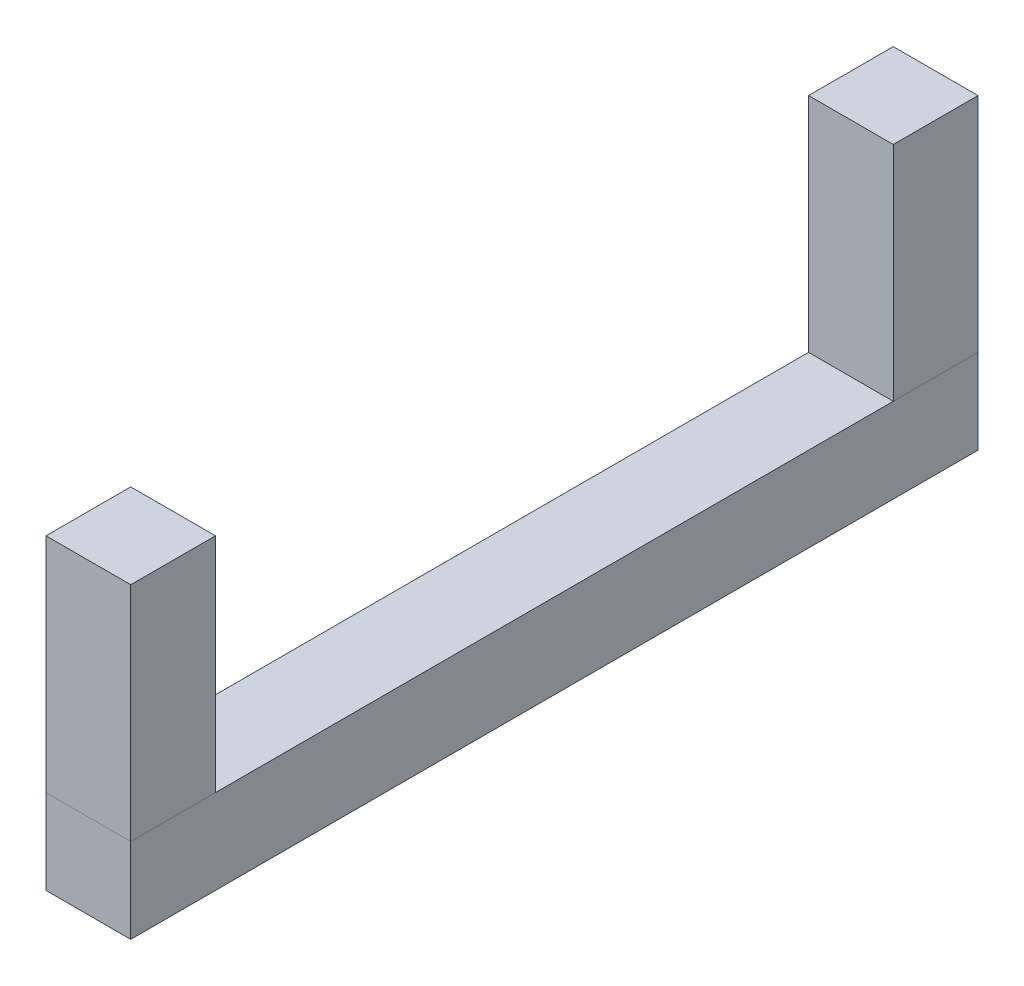
ISO-10303-21;
HEADER;
FILE_DESCRIPTION(('STEP AP214'),'2;1');
FILE_NAME('part.step','',(''),(''),'','','');
FILE_SCHEMA(('AUTOMOTIVE_DESIGN { 1 0 10303 214 1 1 1 1 }'));
ENDSEC;
DATA;
#1=APPLICATION_CONTEXT('core data for automotive mechanical design processes');
#2=APPLICATION_PROTOCOL_DEFINITION('international standard','automotive_design',2000,#1);
#3=PRODUCT_CONTEXT('',#1,'mechanical');
#4=PRODUCT('Part','Part','',(#3));
#5=PRODUCT_RELATED_PRODUCT_CATEGORY('part','',(#4));
#6=PRODUCT_DEFINITION_FORMATION('','',#4);
#7=PRODUCT_DEFINITION_CONTEXT('part definition',#1,'design');
#8=PRODUCT_DEFINITION('design','',#6,#7);
#9=PRODUCT_DEFINITION_SHAPE('','',#8);
#10=(LENGTH_UNIT() NAMED_UNIT(*) SI_UNIT(.MILLI.,.METRE.));
#11=(NAMED_UNIT(*) PLANE_ANGLE_UNIT() SI_UNIT($,.RADIAN.));
#12=(NAMED_UNIT(*) SI_UNIT($,.STERADIAN.) SOLID_ANGLE_UNIT());
#13=UNCERTAINTY_MEASURE_WITH_UNIT(LENGTH_MEASURE(1.E-05),#10,'distance_accuracy_value','');
#14=(GEOMETRIC_REPRESENTATION_CONTEXT(3) GLOBAL_UNCERTAINTY_ASSIGNED_CONTEXT((#13)) GLOBAL_UNIT_ASSIGNED_CONTEXT((#10,
#11,#12)) REPRESENTATION_CONTEXT('',''));
#15=CARTESIAN_POINT('',(0.,0.,0.));
#16=DIRECTION('',(0.,0.,1.));
#17=DIRECTION('',(1.,0.,0.));
#18=AXIS2_PLACEMENT_3D('',#15,#16,#17);
#19=CARTESIAN_POINT('',(86.,-153.,202.));
#20=DIRECTION('',(1.,0.,0.));
#21=DIRECTION('',(0.,1.,0.));
#22=AXIS2_PLACEMENT_3D('',#19,#20,#21);
#23=PLANE('',#22);
#24=DIRECTION('',(0.,0.,1.));
#25=VECTOR('',#24,1.);
#26=CARTESIAN_POINT('',(86.,-153.,202.));
#27=LINE('',#26,#25);
#28=CARTESIAN_POINT('',(86.,-153.,202.));
#29=VERTEX_POINT('',#28);
#30=CARTESIAN_POINT('',(86.,-153.,210.));
#31=VERTEX_POINT('',#30);
#32=EDGE_CURVE('E142',#29,#31,#27,.T.);
#33=ORIENTED_EDGE('',*,*,#32,.F.);
#34=DIRECTION('',(0.,1.,0.));
#35=VECTOR('',#34,1.);
#36=CARTESIAN_POINT('',(86.,-153.,202.));
#37=LINE('',#36,#35);
#38=CARTESIAN_POINT('',(86.,-132.,202.));
#39=VERTEX_POINT('',#38);
#40=EDGE_CURVE('E27',#29,#39,#37,.T.);
#41=ORIENTED_EDGE('',*,*,#40,.T.);
#42=DIRECTION('',(0.,0.,1.));
#43=VECTOR('',#42,1.);
#44=CARTESIAN_POINT('',(86.,-132.,202.));
#45=LINE('',#44,#43);
#46=CARTESIAN_POINT('',(86.,-132.,210.));
#47=VERTEX_POINT('',#46);
#48=EDGE_CURVE('E10',#39,#47,#45,.T.);
#49=ORIENTED_EDGE('',*,*,#48,.T.);
#50=DIRECTION('',(0.,1.,0.));
#51=VECTOR('',#50,1.);
#52=CARTESIAN_POINT('',(86.,-153.,210.));
#53=LINE('',#52,#51);
#54=EDGE_CURVE('E183',#31,#47,#53,.T.);
#55=ORIENTED_EDGE('',*,*,#54,.F.);
#56=EDGE_LOOP('',(#33,#41,#49,#55));
#57=FACE_BOUND('',#56,.T.);
#58=ADVANCED_FACE('F16',(#57),#23,.T.);
#59=CARTESIAN_POINT('',(78.,-132.,202.));
#60=DIRECTION('',(0.,1.,0.));
#61=DIRECTION('',(1.,0.,0.));
#62=AXIS2_PLACEMENT_3D('',#59,#60,#61);
#63=PLANE('',#62);
#64=DIRECTION('',(1.,0.,0.));
#65=VECTOR('',#64,1.);
#66=CARTESIAN_POINT('',(78.,-132.,202.));
#67=LINE('',#66,#65);
#68=CARTESIAN_POINT('',(78.,-132.,202.));
#69=VERTEX_POINT('',#68);
#70=EDGE_CURVE('E217',#69,#39,#67,.T.);
#71=ORIENTED_EDGE('',*,*,#70,.F.);
#72=DIRECTION('',(0.,0.,1.));
#73=VECTOR('',#72,1.);
#74=CARTESIAN_POINT('',(78.,-132.,202.));
#75=LINE('',#74,#73);
#76=CARTESIAN_POINT('',(78.,-132.,210.));
#77=VERTEX_POINT('',#76);
#78=EDGE_CURVE('E178',#69,#77,#75,.T.);
#79=ORIENTED_EDGE('',*,*,#78,.T.);
#80=DIRECTION('',(1.,0.,0.));
#81=VECTOR('',#80,1.);
#82=CARTESIAN_POINT('',(78.,-132.,210.));
#83=LINE('',#82,#81);
#84=EDGE_CURVE('E116',#77,#47,#83,.T.);
#85=ORIENTED_EDGE('',*,*,#84,.T.);
#86=ORIENTED_EDGE('',*,*,#48,.F.);
#87=EDGE_LOOP('',(#71,#79,#85,#86));
#88=FACE_BOUND('',#87,.T.);
#89=ADVANCED_FACE('F255',(#88),#63,.T.);
#90=CARTESIAN_POINT('',(78.,-153.,202.));
#91=DIRECTION('',(0.,0.,1.));
#92=DIRECTION('',(1.,0.,0.));
#93=AXIS2_PLACEMENT_3D('',#90,#91,#92);
#94=PLANE('',#93);
#95=ORIENTED_EDGE('',*,*,#70,.T.);
#96=ORIENTED_EDGE('',*,*,#40,.F.);
#97=DIRECTION('',(1.,0.,0.));
#98=VECTOR('',#97,1.);
#99=CARTESIAN_POINT('',(78.,-153.,202.));
#100=LINE('',#99,#98);
#101=CARTESIAN_POINT('',(78.,-153.,202.));
#102=VERTEX_POINT('',#101);
#103=EDGE_CURVE('E230',#102,#29,#100,.T.);
#104=ORIENTED_EDGE('',*,*,#103,.F.);
#105=DIRECTION('',(0.,1.,0.));
#106=VECTOR('',#105,1.);
#107=CARTESIAN_POINT('',(78.,-153.,202.));
#108=LINE('',#107,#106);
#109=EDGE_CURVE('E180',#102,#69,#108,.T.);
#110=ORIENTED_EDGE('',*,*,#109,.T.);
#111=EDGE_LOOP('',(#95,#96,#104,#110));
#112=FACE_BOUND('',#111,.T.);
#113=ADVANCED_FACE('F253',(#112),#94,.F.);
#114=CARTESIAN_POINT('',(78.,-153.,210.));
#115=DIRECTION('',(0.,0.,1.));
#116=DIRECTION('',(1.,0.,0.));
#117=AXIS2_PLACEMENT_3D('',#114,#115,#116);
#118=PLANE('',#117);
#119=DIRECTION('',(0.,1.,0.));
#120=VECTOR('',#119,1.);
#121=CARTESIAN_POINT('',(78.,-153.,210.));
#122=LINE('',#121,#120);
#123=CARTESIAN_POINT('',(78.,-153.,210.));
#124=VERTEX_POINT('',#123);
#125=EDGE_CURVE('E181',#124,#77,#122,.T.);
#126=ORIENTED_EDGE('',*,*,#125,.F.);
#127=DIRECTION('',(1.,0.,0.));
#128=VECTOR('',#127,1.);
#129=CARTESIAN_POINT('',(78.,-153.,210.));
#130=LINE('',#129,#128);
#131=EDGE_CURVE('E147',#124,#31,#130,.T.);
#132=ORIENTED_EDGE('',*,*,#131,.T.);
#133=ORIENTED_EDGE('',*,*,#54,.T.);
#134=ORIENTED_EDGE('',*,*,#84,.F.);
#135=EDGE_LOOP('',(#126,#132,#133,#134));
#136=FACE_BOUND('',#135,.T.);
#137=ADVANCED_FACE('F259',(#136),#118,.T.);
#138=CARTESIAN_POINT('',(86.,-161.,130.));
#139=DIRECTION('',(1.,0.,0.));
#140=DIRECTION('',(0.,1.,0.));
#141=AXIS2_PLACEMENT_3D('',#138,#139,#140);
#142=PLANE('',#141);
#143=DIRECTION('',(0.,0.,1.));
#144=VECTOR('',#143,1.);
#145=CARTESIAN_POINT('',(86.,-161.,130.));
#146=LINE('',#145,#144);
#147=CARTESIAN_POINT('',(86.,-161.,130.));
#148=VERTEX_POINT('',#147);
#149=CARTESIAN_POINT('',(86.,-161.,210.));
#150=VERTEX_POINT('',#149);
#151=EDGE_CURVE('E141',#148,#150,#146,.T.);
#152=ORIENTED_EDGE('',*,*,#151,.F.);
#153=DIRECTION('',(0.,1.,0.));
#154=VECTOR('',#153,1.);
#155=CARTESIAN_POINT('',(86.,-161.,130.));
#156=LINE('',#155,#154);
#157=CARTESIAN_POINT('',(86.,-153.,130.));
#158=VERTEX_POINT('',#157);
#159=EDGE_CURVE('E188',#148,#158,#156,.T.);
#160=ORIENTED_EDGE('',*,*,#159,.T.);
#161=DIRECTION('',(0.,0.,1.));
#162=VECTOR('',#161,1.);
#163=CARTESIAN_POINT('',(86.,-153.,130.));
#164=LINE('',#163,#162);
#165=CARTESIAN_POINT('',(86.,-153.,138.));
#166=VERTEX_POINT('',#165);
#167=EDGE_CURVE('E20',#158,#166,#164,.T.);
#168=ORIENTED_EDGE('',*,*,#167,.T.);
#169=DIRECTION('',(0.,0.,1.));
#170=VECTOR('',#169,1.);
#171=CARTESIAN_POINT('',(86.,-153.,130.));
#172=LINE('',#171,#170);
#173=EDGE_CURVE('E224',#166,#29,#172,.T.);
#174=ORIENTED_EDGE('',*,*,#173,.T.);
#175=ORIENTED_EDGE('',*,*,#32,.T.);
#176=DIRECTION('',(0.,1.,0.));
#177=VECTOR('',#176,1.);
#178=CARTESIAN_POINT('',(86.,-161.,210.));
#179=LINE('',#178,#177);
#180=EDGE_CURVE('E137',#150,#31,#179,.T.);
#181=ORIENTED_EDGE('',*,*,#180,.F.);
#182=EDGE_LOOP('',(#152,#160,#168,#174,#175,#181));
#183=FACE_BOUND('',#182,.T.);
#184=ADVANCED_FACE('F139',(#183),#142,.T.);
#185=CARTESIAN_POINT('',(86.,-153.,130.));
#186=DIRECTION('',(1.,0.,0.));
#187=DIRECTION('',(0.,1.,0.));
#188=AXIS2_PLACEMENT_3D('',#185,#186,#187);
#189=PLANE('',#188);
#190=ORIENTED_EDGE('',*,*,#167,.F.);
#191=DIRECTION('',(0.,1.,0.));
#192=VECTOR('',#191,1.);
#193=CARTESIAN_POINT('',(86.,-153.,130.));
#194=LINE('',#193,#192);
#195=CARTESIAN_POINT('',(86.,-132.,130.));
#196=VERTEX_POINT('',#195);
#197=EDGE_CURVE('E71',#158,#196,#194,.T.);
#198=ORIENTED_EDGE('',*,*,#197,.T.);
#199=DIRECTION('',(0.,0.,1.));
#200=VECTOR('',#199,1.);
#201=CARTESIAN_POINT('',(86.,-132.,130.));
#202=LINE('',#201,#200);
#203=CARTESIAN_POINT('',(86.,-132.,138.));
#204=VERTEX_POINT('',#203);
#205=EDGE_CURVE('E77',#196,#204,#202,.T.);
#206=ORIENTED_EDGE('',*,*,#205,.T.);
#207=DIRECTION('',(0.,1.,0.));
#208=VECTOR('',#207,1.);
#209=CARTESIAN_POINT('',(86.,-153.,138.));
#210=LINE('',#209,#208);
#211=EDGE_CURVE('E196',#166,#204,#210,.T.);
#212=ORIENTED_EDGE('',*,*,#211,.F.);
#213=EDGE_LOOP('',(#190,#198,#206,#212));
#214=FACE_BOUND('',#213,.T.);
#215=ADVANCED_FACE('F311',(#214),#189,.T.);
#216=CARTESIAN_POINT('',(78.,-161.,130.));
#217=DIRECTION('',(0.,0.,1.));
#218=DIRECTION('',(1.,0.,0.));
#219=AXIS2_PLACEMENT_3D('',#216,#217,#218);
#220=PLANE('',#219);
#221=DIRECTION('',(1.,0.,0.));
#222=VECTOR('',#221,1.);
#223=CARTESIAN_POINT('',(78.,-153.,130.));
#224=LINE('',#223,#222);
#225=CARTESIAN_POINT('',(78.,-153.,130.));
#226=VERTEX_POINT('',#225);
#227=EDGE_CURVE('E162',#226,#158,#224,.T.);
#228=ORIENTED_EDGE('',*,*,#227,.T.);
#229=ORIENTED_EDGE('',*,*,#159,.F.);
#230=DIRECTION('',(1.,0.,0.));
#231=VECTOR('',#230,1.);
#232=CARTESIAN_POINT('',(78.,-161.,130.));
#233=LINE('',#232,#231);
#234=CARTESIAN_POINT('',(78.,-161.,130.));
#235=VERTEX_POINT('',#234);
#236=EDGE_CURVE('E148',#235,#148,#233,.T.);
#237=ORIENTED_EDGE('',*,*,#236,.F.);
#238=DIRECTION('',(0.,1.,0.));
#239=VECTOR('',#238,1.);
#240=CARTESIAN_POINT('',(78.,-161.,130.));
#241=LINE('',#240,#239);
#242=EDGE_CURVE('E195',#235,#226,#241,.T.);
#243=ORIENTED_EDGE('',*,*,#242,.T.);
#244=EDGE_LOOP('',(#228,#229,#237,#243));
#245=FACE_BOUND('',#244,.T.);
#246=ADVANCED_FACE('F306',(#245),#220,.F.);
#247=CARTESIAN_POINT('',(78.,-153.,202.));
#248=DIRECTION('',(1.,0.,0.));
#249=DIRECTION('',(0.,1.,0.));
#250=AXIS2_PLACEMENT_3D('',#247,#248,#249);
#251=PLANE('',#250);
#252=ORIENTED_EDGE('',*,*,#125,.T.);
#253=ORIENTED_EDGE('',*,*,#78,.F.);
#254=ORIENTED_EDGE('',*,*,#109,.F.);
#255=DIRECTION('',(0.,0.,1.));
#256=VECTOR('',#255,1.);
#257=CARTESIAN_POINT('',(78.,-153.,202.));
#258=LINE('',#257,#256);
#259=EDGE_CURVE('E174',#102,#124,#258,.T.);
#260=ORIENTED_EDGE('',*,*,#259,.T.);
#261=EDGE_LOOP('',(#252,#253,#254,#260));
#262=FACE_BOUND('',#261,.T.);
#263=ADVANCED_FACE('F257',(#262),#251,.F.);
#264=CARTESIAN_POINT('',(78.,-153.,130.));
#265=DIRECTION('',(0.,1.,0.));
#266=DIRECTION('',(1.,0.,0.));
#267=AXIS2_PLACEMENT_3D('',#264,#265,#266);
#268=PLANE('',#267);
#269=DIRECTION('',(1.,0.,0.));
#270=VECTOR('',#269,1.);
#271=CARTESIAN_POINT('',(78.,-153.,138.));
#272=LINE('',#271,#270);
#273=CARTESIAN_POINT('',(78.,-153.,138.));
#274=VERTEX_POINT('',#273);
#275=EDGE_CURVE('E194',#274,#166,#272,.T.);
#276=ORIENTED_EDGE('',*,*,#275,.F.);
#277=DIRECTION('',(0.,0.,1.));
#278=VECTOR('',#277,1.);
#279=CARTESIAN_POINT('',(78.,-153.,130.));
#280=LINE('',#279,#278);
#281=EDGE_CURVE('E177',#274,#102,#280,.T.);
#282=ORIENTED_EDGE('',*,*,#281,.T.);
#283=ORIENTED_EDGE('',*,*,#103,.T.);
#284=ORIENTED_EDGE('',*,*,#173,.F.);
#285=EDGE_LOOP('',(#276,#282,#283,#284));
#286=FACE_BOUND('',#285,.T.);
#287=ADVANCED_FACE('F268',(#286),#268,.T.);
#288=CARTESIAN_POINT('',(78.,-161.,210.));
#289=DIRECTION('',(0.,0.,1.));
#290=DIRECTION('',(1.,0.,0.));
#291=AXIS2_PLACEMENT_3D('',#288,#289,#290);
#292=PLANE('',#291);
#293=DIRECTION('',(0.,1.,0.));
#294=VECTOR('',#293,1.);
#295=CARTESIAN_POINT('',(78.,-161.,210.));
#296=LINE('',#295,#294);
#297=CARTESIAN_POINT('',(78.,-161.,210.));
#298=VERTEX_POINT('',#297);
#299=EDGE_CURVE('E153',#298,#124,#296,.T.);
#300=ORIENTED_EDGE('',*,*,#299,.F.);
#301=DIRECTION('',(1.,0.,0.));
#302=VECTOR('',#301,1.);
#303=CARTESIAN_POINT('',(78.,-161.,210.));
#304=LINE('',#303,#302);
#305=EDGE_CURVE('E151',#298,#150,#304,.T.);
#306=ORIENTED_EDGE('',*,*,#305,.T.);
#307=ORIENTED_EDGE('',*,*,#180,.T.);
#308=ORIENTED_EDGE('',*,*,#131,.F.);
#309=EDGE_LOOP('',(#300,#306,#307,#308));
#310=FACE_BOUND('',#309,.T.);
#311=ADVANCED_FACE('F18',(#310),#292,.T.);
#312=CARTESIAN_POINT('',(78.,-161.,130.));
#313=DIRECTION('',(0.,1.,0.));
#314=DIRECTION('',(1.,0.,0.));
#315=AXIS2_PLACEMENT_3D('',#312,#313,#314);
#316=PLANE('',#315);
#317=ORIENTED_EDGE('',*,*,#151,.T.);
#318=ORIENTED_EDGE('',*,*,#305,.F.);
#319=DIRECTION('',(0.,0.,1.));
#320=VECTOR('',#319,1.);
#321=CARTESIAN_POINT('',(78.,-161.,130.));
#322=LINE('',#321,#320);
#323=EDGE_CURVE('E191',#235,#298,#322,.T.);
#324=ORIENTED_EDGE('',*,*,#323,.F.);
#325=ORIENTED_EDGE('',*,*,#236,.T.);
#326=EDGE_LOOP('',(#317,#318,#324,#325));
#327=FACE_BOUND('',#326,.T.);
#328=ADVANCED_FACE('F160',(#327),#316,.F.);
#329=CARTESIAN_POINT('',(78.,-153.,130.));
#330=DIRECTION('',(0.,0.,1.));
#331=DIRECTION('',(1.,0.,0.));
#332=AXIS2_PLACEMENT_3D('',#329,#330,#331);
#333=PLANE('',#332);
#334=DIRECTION('',(1.,0.,0.));
#335=VECTOR('',#334,1.);
#336=CARTESIAN_POINT('',(78.,-132.,130.));
#337=LINE('',#336,#335);
#338=CARTESIAN_POINT('',(78.,-132.,130.));
#339=VERTEX_POINT('',#338);
#340=EDGE_CURVE('E215',#339,#196,#337,.T.);
#341=ORIENTED_EDGE('',*,*,#340,.T.);
#342=ORIENTED_EDGE('',*,*,#197,.F.);
#343=ORIENTED_EDGE('',*,*,#227,.F.);
#344=DIRECTION('',(0.,1.,0.));
#345=VECTOR('',#344,1.);
#346=CARTESIAN_POINT('',(78.,-153.,130.));
#347=LINE('',#346,#345);
#348=EDGE_CURVE('E205',#226,#339,#347,.T.);
#349=ORIENTED_EDGE('',*,*,#348,.T.);
#350=EDGE_LOOP('',(#341,#342,#343,#349));
#351=FACE_BOUND('',#350,.T.);
#352=ADVANCED_FACE('F289',(#351),#333,.F.);
#353=CARTESIAN_POINT('',(78.,-132.,130.));
#354=DIRECTION('',(0.,1.,0.));
#355=DIRECTION('',(1.,0.,0.));
#356=AXIS2_PLACEMENT_3D('',#353,#354,#355);
#357=PLANE('',#356);
#358=ORIENTED_EDGE('',*,*,#340,.F.);
#359=DIRECTION('',(0.,0.,1.));
#360=VECTOR('',#359,1.);
#361=CARTESIAN_POINT('',(78.,-132.,130.));
#362=LINE('',#361,#360);
#363=CARTESIAN_POINT('',(78.,-132.,138.));
#364=VERTEX_POINT('',#363);
#365=EDGE_CURVE('E172',#339,#364,#362,.T.);
#366=ORIENTED_EDGE('',*,*,#365,.T.);
#367=DIRECTION('',(1.,0.,0.));
#368=VECTOR('',#367,1.);
#369=CARTESIAN_POINT('',(78.,-132.,138.));
#370=LINE('',#369,#368);
#371=EDGE_CURVE('E200',#364,#204,#370,.T.);
#372=ORIENTED_EDGE('',*,*,#371,.T.);
#373=ORIENTED_EDGE('',*,*,#205,.F.);
#374=EDGE_LOOP('',(#358,#366,#372,#373));
#375=FACE_BOUND('',#374,.T.);
#376=ADVANCED_FACE('F283',(#375),#357,.T.);
#377=CARTESIAN_POINT('',(78.,-153.,138.));
#378=DIRECTION('',(0.,0.,1.));
#379=DIRECTION('',(1.,0.,0.));
#380=AXIS2_PLACEMENT_3D('',#377,#378,#379);
#381=PLANE('',#380);
#382=DIRECTION('',(0.,1.,0.));
#383=VECTOR('',#382,1.);
#384=CARTESIAN_POINT('',(78.,-153.,138.));
#385=LINE('',#384,#383);
#386=EDGE_CURVE('E201',#274,#364,#385,.T.);
#387=ORIENTED_EDGE('',*,*,#386,.F.);
#388=ORIENTED_EDGE('',*,*,#275,.T.);
#389=ORIENTED_EDGE('',*,*,#211,.T.);
#390=ORIENTED_EDGE('',*,*,#371,.F.);
#391=EDGE_LOOP('',(#387,#388,#389,#390));
#392=FACE_BOUND('',#391,.T.);
#393=ADVANCED_FACE('F288',(#392),#381,.T.);
#394=CARTESIAN_POINT('',(78.,-161.,130.));
#395=DIRECTION('',(1.,0.,0.));
#396=DIRECTION('',(0.,1.,0.));
#397=AXIS2_PLACEMENT_3D('',#394,#395,#396);
#398=PLANE('',#397);
#399=ORIENTED_EDGE('',*,*,#299,.T.);
#400=ORIENTED_EDGE('',*,*,#259,.F.);
#401=ORIENTED_EDGE('',*,*,#281,.F.);
#402=DIRECTION('',(0.,0.,1.));
#403=VECTOR('',#402,1.);
#404=CARTESIAN_POINT('',(78.,-153.,130.));
#405=LINE('',#404,#403);
#406=EDGE_CURVE('E209',#226,#274,#405,.T.);
#407=ORIENTED_EDGE('',*,*,#406,.F.);
#408=ORIENTED_EDGE('',*,*,#242,.F.);
#409=ORIENTED_EDGE('',*,*,#323,.T.);
#410=EDGE_LOOP('',(#399,#400,#401,#407,#408,#409));
#411=FACE_BOUND('',#410,.T.);
#412=ADVANCED_FACE('F326',(#411),#398,.F.);
#413=CARTESIAN_POINT('',(78.,-153.,130.));
#414=DIRECTION('',(1.,0.,0.));
#415=DIRECTION('',(0.,1.,0.));
#416=AXIS2_PLACEMENT_3D('',#413,#414,#415);
#417=PLANE('',#416);
#418=ORIENTED_EDGE('',*,*,#386,.T.);
#419=ORIENTED_EDGE('',*,*,#365,.F.);
#420=ORIENTED_EDGE('',*,*,#348,.F.);
#421=ORIENTED_EDGE('',*,*,#406,.T.);
#422=EDGE_LOOP('',(#418,#419,#420,#421));
#423=FACE_BOUND('',#422,.T.);
#424=ADVANCED_FACE('F331',(#423),#417,.F.);
#425=CLOSED_SHELL('',(#58,#89,#113,#137,#184,#215,#246,#263,#287,#311,#328,#352,#376,#393,#412,#424));
#426=MANIFOLD_SOLID_BREP('B1',#425);
#427=ADVANCED_BREP_SHAPE_REPRESENTATION('',(#18,#426),#14);
#428=SHAPE_DEFINITION_REPRESENTATION(#9,#427);
ENDSEC;
END-ISO-10303-21;
